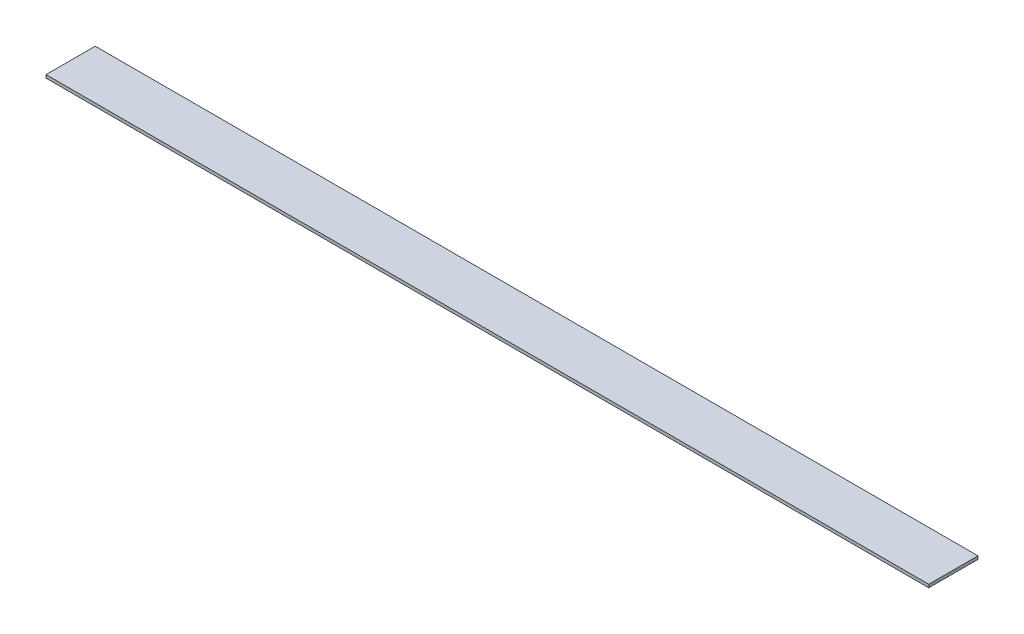
ISO-10303-21;
HEADER;
FILE_DESCRIPTION(('STEP AP214'),'2;1');
FILE_NAME('part.step','',(''),(''),'','','');
FILE_SCHEMA(('AUTOMOTIVE_DESIGN { 1 0 10303 214 1 1 1 1 }'));
ENDSEC;
DATA;
#1=APPLICATION_CONTEXT('core data for automotive mechanical design processes');
#2=APPLICATION_PROTOCOL_DEFINITION('international standard','automotive_design',2000,#1);
#3=PRODUCT_CONTEXT('',#1,'mechanical');
#4=PRODUCT('Part','Part','',(#3));
#5=PRODUCT_RELATED_PRODUCT_CATEGORY('part','',(#4));
#6=PRODUCT_DEFINITION_FORMATION('','',#4);
#7=PRODUCT_DEFINITION_CONTEXT('part definition',#1,'design');
#8=PRODUCT_DEFINITION('design','',#6,#7);
#9=PRODUCT_DEFINITION_SHAPE('','',#8);
#10=(LENGTH_UNIT() NAMED_UNIT(*) SI_UNIT(.MILLI.,.METRE.));
#11=(NAMED_UNIT(*) PLANE_ANGLE_UNIT() SI_UNIT($,.RADIAN.));
#12=(NAMED_UNIT(*) SI_UNIT($,.STERADIAN.) SOLID_ANGLE_UNIT());
#13=UNCERTAINTY_MEASURE_WITH_UNIT(LENGTH_MEASURE(1.E-05),#10,'distance_accuracy_value','');
#14=(GEOMETRIC_REPRESENTATION_CONTEXT(3) GLOBAL_UNCERTAINTY_ASSIGNED_CONTEXT((#13)) GLOBAL_UNIT_ASSIGNED_CONTEXT((#10,
#11,#12)) REPRESENTATION_CONTEXT('',''));
#15=CARTESIAN_POINT('',(0.,0.,0.));
#16=DIRECTION('',(0.,0.,1.));
#17=DIRECTION('',(1.,0.,0.));
#18=AXIS2_PLACEMENT_3D('',#15,#16,#17);
#19=CARTESIAN_POINT('',(0.,3.175,0.));
#20=DIRECTION('',(1.,0.,0.));
#21=DIRECTION('',(0.,0.,-1.));
#22=AXIS2_PLACEMENT_3D('',#19,#20,#21);
#23=PLANE('',#22);
#24=DIRECTION('',(0.,0.,1.));
#25=VECTOR('',#24,1.);
#26=CARTESIAN_POINT('',(0.,0.,0.));
#27=LINE('',#26,#25);
#28=CARTESIAN_POINT('',(0.,0.,-50.8));
#29=VERTEX_POINT('',#28);
#30=CARTESIAN_POINT('',(0.,0.,0.));
#31=VERTEX_POINT('',#30);
#32=EDGE_CURVE('E95',#29,#31,#27,.T.);
#33=ORIENTED_EDGE('',*,*,#32,.T.);
#34=DIRECTION('',(0.,-1.,0.));
#35=VECTOR('',#34,1.);
#36=CARTESIAN_POINT('',(0.,3.175,0.));
#37=LINE('',#36,#35);
#38=CARTESIAN_POINT('',(0.,3.175,0.));
#39=VERTEX_POINT('',#38);
#40=EDGE_CURVE('E11',#39,#31,#37,.T.);
#41=ORIENTED_EDGE('',*,*,#40,.F.);
#42=DIRECTION('',(0.,0.,1.));
#43=VECTOR('',#42,1.);
#44=CARTESIAN_POINT('',(0.,3.175,0.));
#45=LINE('',#44,#43);
#46=CARTESIAN_POINT('',(0.,3.175,-50.8));
#47=VERTEX_POINT('',#46);
#48=EDGE_CURVE('E83',#47,#39,#45,.T.);
#49=ORIENTED_EDGE('',*,*,#48,.F.);
#50=DIRECTION('',(0.,-1.,0.));
#51=VECTOR('',#50,1.);
#52=CARTESIAN_POINT('',(0.,3.175,-50.8));
#53=LINE('',#52,#51);
#54=EDGE_CURVE('E91',#47,#29,#53,.T.);
#55=ORIENTED_EDGE('',*,*,#54,.T.);
#56=EDGE_LOOP('',(#33,#41,#49,#55));
#57=FACE_BOUND('',#56,.T.);
#58=ADVANCED_FACE('F32',(#57),#23,.F.);
#59=CARTESIAN_POINT('',(0.,3.175,0.));
#60=DIRECTION('',(0.,0.,-1.));
#61=DIRECTION('',(-1.,0.,0.));
#62=AXIS2_PLACEMENT_3D('',#59,#60,#61);
#63=PLANE('',#62);
#64=DIRECTION('',(1.,0.,0.));
#65=VECTOR('',#64,1.);
#66=CARTESIAN_POINT('',(0.,0.,0.));
#67=LINE('',#66,#65);
#68=CARTESIAN_POINT('',(910.88,0.,0.));
#69=VERTEX_POINT('',#68);
#70=EDGE_CURVE('E87',#31,#69,#67,.T.);
#71=ORIENTED_EDGE('',*,*,#70,.T.);
#72=DIRECTION('',(0.,-1.,0.));
#73=VECTOR('',#72,1.);
#74=CARTESIAN_POINT('',(910.88,3.175,0.));
#75=LINE('',#74,#73);
#76=CARTESIAN_POINT('',(910.88,3.175,0.));
#77=VERTEX_POINT('',#76);
#78=EDGE_CURVE('E40',#77,#69,#75,.T.);
#79=ORIENTED_EDGE('',*,*,#78,.F.);
#80=DIRECTION('',(1.,0.,0.));
#81=VECTOR('',#80,1.);
#82=CARTESIAN_POINT('',(0.,3.175,0.));
#83=LINE('',#82,#81);
#84=EDGE_CURVE('E78',#39,#77,#83,.T.);
#85=ORIENTED_EDGE('',*,*,#84,.F.);
#86=ORIENTED_EDGE('',*,*,#40,.T.);
#87=EDGE_LOOP('',(#71,#79,#85,#86));
#88=FACE_BOUND('',#87,.T.);
#89=ADVANCED_FACE('F86',(#88),#63,.F.);
#90=CARTESIAN_POINT('',(910.88,3.175,0.));
#91=DIRECTION('',(-1.,0.,0.));
#92=DIRECTION('',(0.,0.,1.));
#93=AXIS2_PLACEMENT_3D('',#90,#91,#92);
#94=PLANE('',#93);
#95=DIRECTION('',(0.,0.,-1.));
#96=VECTOR('',#95,1.);
#97=CARTESIAN_POINT('',(910.88,0.,0.));
#98=LINE('',#97,#96);
#99=CARTESIAN_POINT('',(910.88,0.,-50.8));
#100=VERTEX_POINT('',#99);
#101=EDGE_CURVE('E65',#69,#100,#98,.T.);
#102=ORIENTED_EDGE('',*,*,#101,.T.);
#103=DIRECTION('',(0.,-1.,0.));
#104=VECTOR('',#103,1.);
#105=CARTESIAN_POINT('',(910.88,3.175,-50.8));
#106=LINE('',#105,#104);
#107=CARTESIAN_POINT('',(910.88,3.175,-50.8));
#108=VERTEX_POINT('',#107);
#109=EDGE_CURVE('E88',#108,#100,#106,.T.);
#110=ORIENTED_EDGE('',*,*,#109,.F.);
#111=DIRECTION('',(0.,0.,-1.));
#112=VECTOR('',#111,1.);
#113=CARTESIAN_POINT('',(910.88,3.175,0.));
#114=LINE('',#113,#112);
#115=EDGE_CURVE('E81',#77,#108,#114,.T.);
#116=ORIENTED_EDGE('',*,*,#115,.F.);
#117=ORIENTED_EDGE('',*,*,#78,.T.);
#118=EDGE_LOOP('',(#102,#110,#116,#117));
#119=FACE_BOUND('',#118,.T.);
#120=ADVANCED_FACE('F89',(#119),#94,.F.);
#121=CARTESIAN_POINT('',(0.,3.175,-50.8));
#122=DIRECTION('',(0.,0.,1.));
#123=DIRECTION('',(1.,0.,0.));
#124=AXIS2_PLACEMENT_3D('',#121,#122,#123);
#125=PLANE('',#124);
#126=DIRECTION('',(-1.,0.,0.));
#127=VECTOR('',#126,1.);
#128=CARTESIAN_POINT('',(0.,0.,-50.8));
#129=LINE('',#128,#127);
#130=EDGE_CURVE('E71',#100,#29,#129,.T.);
#131=ORIENTED_EDGE('',*,*,#130,.T.);
#132=ORIENTED_EDGE('',*,*,#54,.F.);
#133=DIRECTION('',(-1.,0.,0.));
#134=VECTOR('',#133,1.);
#135=CARTESIAN_POINT('',(0.,3.175,-50.8));
#136=LINE('',#135,#134);
#137=EDGE_CURVE('E48',#108,#47,#136,.T.);
#138=ORIENTED_EDGE('',*,*,#137,.F.);
#139=ORIENTED_EDGE('',*,*,#109,.T.);
#140=EDGE_LOOP('',(#131,#132,#138,#139));
#141=FACE_BOUND('',#140,.T.);
#142=ADVANCED_FACE('F102',(#141),#125,.F.);
#143=CARTESIAN_POINT('',(0.,3.175,0.));
#144=DIRECTION('',(0.,-1.,0.));
#145=DIRECTION('',(0.,0.,-1.));
#146=AXIS2_PLACEMENT_3D('',#143,#144,#145);
#147=PLANE('',#146);
#148=ORIENTED_EDGE('',*,*,#48,.T.);
#149=ORIENTED_EDGE('',*,*,#84,.T.);
#150=ORIENTED_EDGE('',*,*,#115,.T.);
#151=ORIENTED_EDGE('',*,*,#137,.T.);
#152=EDGE_LOOP('',(#148,#149,#150,#151));
#153=FACE_BOUND('',#152,.T.);
#154=ADVANCED_FACE('F79',(#153),#147,.F.);
#155=CARTESIAN_POINT('',(0.,0.,0.));
#156=DIRECTION('',(0.,-1.,0.));
#157=DIRECTION('',(0.,0.,-1.));
#158=AXIS2_PLACEMENT_3D('',#155,#156,#157);
#159=PLANE('',#158);
#160=ORIENTED_EDGE('',*,*,#32,.F.);
#161=ORIENTED_EDGE('',*,*,#130,.F.);
#162=ORIENTED_EDGE('',*,*,#101,.F.);
#163=ORIENTED_EDGE('',*,*,#70,.F.);
#164=EDGE_LOOP('',(#160,#161,#162,#163));
#165=FACE_BOUND('',#164,.T.);
#166=ADVANCED_FACE('F105',(#165),#159,.T.);
#167=CLOSED_SHELL('',(#58,#89,#120,#142,#154,#166));
#168=MANIFOLD_SOLID_BREP('B2',#167);
#169=ADVANCED_BREP_SHAPE_REPRESENTATION('',(#18,#168),#14);
#170=SHAPE_DEFINITION_REPRESENTATION(#9,#169);
ENDSEC;
END-ISO-10303-21;
